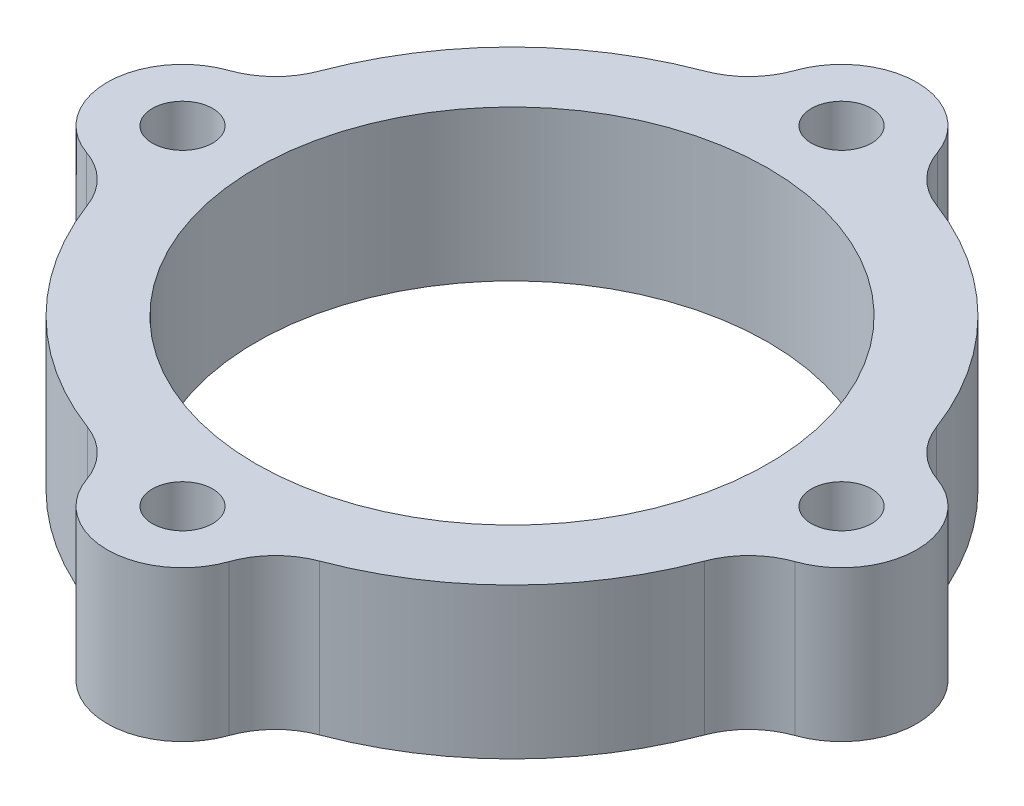
ISO-10303-21;
HEADER;
FILE_DESCRIPTION(('STEP AP214'),'2;1');
FILE_NAME('part.step','',(''),(''),'','','');
FILE_SCHEMA(('AUTOMOTIVE_DESIGN { 1 0 10303 214 1 1 1 1 }'));
ENDSEC;
DATA;
#1=APPLICATION_CONTEXT('core data for automotive mechanical design processes');
#2=APPLICATION_PROTOCOL_DEFINITION('international standard','automotive_design',2000,#1);
#3=PRODUCT_CONTEXT('',#1,'mechanical');
#4=PRODUCT('Part','Part','',(#3));
#5=PRODUCT_RELATED_PRODUCT_CATEGORY('part','',(#4));
#6=PRODUCT_DEFINITION_FORMATION('','',#4);
#7=PRODUCT_DEFINITION_CONTEXT('part definition',#1,'design');
#8=PRODUCT_DEFINITION('design','',#6,#7);
#9=PRODUCT_DEFINITION_SHAPE('','',#8);
#10=(LENGTH_UNIT() NAMED_UNIT(*) SI_UNIT(.MILLI.,.METRE.));
#11=(NAMED_UNIT(*) PLANE_ANGLE_UNIT() SI_UNIT($,.RADIAN.));
#12=(NAMED_UNIT(*) SI_UNIT($,.STERADIAN.) SOLID_ANGLE_UNIT());
#13=UNCERTAINTY_MEASURE_WITH_UNIT(LENGTH_MEASURE(1.E-05),#10,'distance_accuracy_value','');
#14=(GEOMETRIC_REPRESENTATION_CONTEXT(3) GLOBAL_UNCERTAINTY_ASSIGNED_CONTEXT((#13)) GLOBAL_UNIT_ASSIGNED_CONTEXT((#10,
#11,#12)) REPRESENTATION_CONTEXT('',''));
#15=CARTESIAN_POINT('',(0.,0.,0.));
#16=DIRECTION('',(0.,0.,1.));
#17=DIRECTION('',(1.,0.,0.));
#18=AXIS2_PLACEMENT_3D('',#15,#16,#17);
#19=CARTESIAN_POINT('',(17.5,8.,0.));
#20=DIRECTION('',(0.,-1.,0.));
#21=DIRECTION('',(0.,0.,-1.));
#22=AXIS2_PLACEMENT_3D('',#19,#20,#21);
#23=CYLINDRICAL_SURFACE('',#22,4.);
#24=CARTESIAN_POINT('',(17.5,8.,0.));
#25=DIRECTION('',(0.,1.,0.));
#26=DIRECTION('',(0.,0.,1.));
#27=AXIS2_PLACEMENT_3D('',#24,#25,#26);
#28=CIRCLE('',#27,4.);
#29=CARTESIAN_POINT('',(18.8142857142857,8.,3.77791649738642));
#30=VERTEX_POINT('',#29);
#31=CARTESIAN_POINT('',(18.8142857142857,8.,-3.77791649738642));
#32=VERTEX_POINT('',#31);
#33=EDGE_CURVE('E207',#30,#32,#28,.T.);
#34=ORIENTED_EDGE('',*,*,#33,.F.);
#35=DIRECTION('',(0.,-1.,0.));
#36=VECTOR('',#35,1.);
#37=CARTESIAN_POINT('',(18.8142857142857,8.,3.77791649738642));
#38=LINE('',#37,#36);
#39=CARTESIAN_POINT('',(18.8142857142857,0.,3.77791649738642));
#40=VERTEX_POINT('',#39);
#41=EDGE_CURVE('E225',#30,#40,#38,.T.);
#42=ORIENTED_EDGE('',*,*,#41,.T.);
#43=CARTESIAN_POINT('',(17.5,0.,0.));
#44=DIRECTION('',(0.,1.,0.));
#45=DIRECTION('',(0.,0.,1.));
#46=AXIS2_PLACEMENT_3D('',#43,#44,#45);
#47=CIRCLE('',#46,4.);
#48=CARTESIAN_POINT('',(18.8142857142857,0.,-3.77791649738642));
#49=VERTEX_POINT('',#48);
#50=EDGE_CURVE('E311',#40,#49,#47,.T.);
#51=ORIENTED_EDGE('',*,*,#50,.T.);
#52=DIRECTION('',(0.,-1.,0.));
#53=VECTOR('',#52,1.);
#54=CARTESIAN_POINT('',(18.8142857142857,8.,-3.77791649738642));
#55=LINE('',#54,#53);
#56=EDGE_CURVE('E223',#49,#32,#55,.F.);
#57=ORIENTED_EDGE('',*,*,#56,.T.);
#58=EDGE_LOOP('',(#34,#42,#51,#57));
#59=FACE_BOUND('',#58,.T.);
#60=ADVANCED_FACE('F39',(#59),#23,.T.);
#61=CARTESIAN_POINT('',(0.,8.,0.));
#62=DIRECTION('',(0.,-1.,0.));
#63=DIRECTION('',(0.,0.,-1.));
#64=AXIS2_PLACEMENT_3D('',#61,#62,#63);
#65=CYLINDRICAL_SURFACE('',#64,17.5);
#66=CARTESIAN_POINT('',(0.,8.,0.));
#67=DIRECTION('',(0.,1.,0.));
#68=DIRECTION('',(0.,0.,1.));
#69=AXIS2_PLACEMENT_3D('',#66,#67,#68);
#70=CIRCLE('',#69,17.5);
#71=CARTESIAN_POINT('',(16.3837209302326,8.,-6.15009662365232));
#72=VERTEX_POINT('',#71);
#73=CARTESIAN_POINT('',(6.15009662365231,8.,-16.3837209302326));
#74=VERTEX_POINT('',#73);
#75=EDGE_CURVE('E286',#72,#74,#70,.T.);
#76=ORIENTED_EDGE('',*,*,#75,.F.);
#77=DIRECTION('',(0.,-1.,0.));
#78=VECTOR('',#77,1.);
#79=CARTESIAN_POINT('',(16.3837209302326,8.,-6.15009662365232));
#80=LINE('',#79,#78);
#81=CARTESIAN_POINT('',(16.3837209302326,0.,-6.15009662365232));
#82=VERTEX_POINT('',#81);
#83=EDGE_CURVE('E230',#72,#82,#80,.T.);
#84=ORIENTED_EDGE('',*,*,#83,.T.);
#85=CARTESIAN_POINT('',(0.,0.,0.));
#86=DIRECTION('',(0.,1.,0.));
#87=DIRECTION('',(0.,0.,1.));
#88=AXIS2_PLACEMENT_3D('',#85,#86,#87);
#89=CIRCLE('',#88,17.5);
#90=CARTESIAN_POINT('',(6.15009662365231,0.,-16.3837209302326));
#91=VERTEX_POINT('',#90);
#92=EDGE_CURVE('E276',#82,#91,#89,.T.);
#93=ORIENTED_EDGE('',*,*,#92,.T.);
#94=DIRECTION('',(0.,-1.,0.));
#95=VECTOR('',#94,1.);
#96=CARTESIAN_POINT('',(6.15009662365231,8.,-16.3837209302326));
#97=LINE('',#96,#95);
#98=EDGE_CURVE('E228',#91,#74,#97,.F.);
#99=ORIENTED_EDGE('',*,*,#98,.T.);
#100=EDGE_LOOP('',(#76,#84,#93,#99));
#101=FACE_BOUND('',#100,.T.);
#102=ADVANCED_FACE('F319',(#101),#65,.T.);
#103=CARTESIAN_POINT('',(0.,8.,-17.5));
#104=DIRECTION('',(0.,-1.,0.));
#105=DIRECTION('',(0.,0.,-1.));
#106=AXIS2_PLACEMENT_3D('',#103,#104,#105);
#107=CYLINDRICAL_SURFACE('',#106,4.);
#108=CARTESIAN_POINT('',(0.,8.,-17.5));
#109=DIRECTION('',(0.,1.,0.));
#110=DIRECTION('',(0.,0.,1.));
#111=AXIS2_PLACEMENT_3D('',#108,#109,#110);
#112=CIRCLE('',#111,4.);
#113=CARTESIAN_POINT('',(3.77791649738642,8.,-18.8142857142857));
#114=VERTEX_POINT('',#113);
#115=CARTESIAN_POINT('',(-3.77791649738642,8.,-18.8142857142857));
#116=VERTEX_POINT('',#115);
#117=EDGE_CURVE('E282',#114,#116,#112,.T.);
#118=ORIENTED_EDGE('',*,*,#117,.F.);
#119=DIRECTION('',(0.,-1.,0.));
#120=VECTOR('',#119,1.);
#121=CARTESIAN_POINT('',(3.77791649738642,8.,-18.8142857142857));
#122=LINE('',#121,#120);
#123=CARTESIAN_POINT('',(3.77791649738642,0.,-18.8142857142857));
#124=VERTEX_POINT('',#123);
#125=EDGE_CURVE('E235',#114,#124,#122,.T.);
#126=ORIENTED_EDGE('',*,*,#125,.T.);
#127=CARTESIAN_POINT('',(0.,0.,-17.5));
#128=DIRECTION('',(0.,1.,0.));
#129=DIRECTION('',(0.,0.,1.));
#130=AXIS2_PLACEMENT_3D('',#127,#128,#129);
#131=CIRCLE('',#130,4.);
#132=CARTESIAN_POINT('',(-3.77791649738642,0.,-18.8142857142857));
#133=VERTEX_POINT('',#132);
#134=EDGE_CURVE('E268',#124,#133,#131,.T.);
#135=ORIENTED_EDGE('',*,*,#134,.T.);
#136=DIRECTION('',(0.,-1.,0.));
#137=VECTOR('',#136,1.);
#138=CARTESIAN_POINT('',(-3.77791649738642,8.,-18.8142857142857));
#139=LINE('',#138,#137);
#140=EDGE_CURVE('E233',#133,#116,#139,.F.);
#141=ORIENTED_EDGE('',*,*,#140,.T.);
#142=EDGE_LOOP('',(#118,#126,#135,#141));
#143=FACE_BOUND('',#142,.T.);
#144=ADVANCED_FACE('F274',(#143),#107,.T.);
#145=CARTESIAN_POINT('',(0.,8.,0.));
#146=DIRECTION('',(0.,-1.,0.));
#147=DIRECTION('',(0.,0.,-1.));
#148=AXIS2_PLACEMENT_3D('',#145,#146,#147);
#149=CYLINDRICAL_SURFACE('',#148,17.5);
#150=CARTESIAN_POINT('',(0.,0.,0.));
#151=DIRECTION('',(0.,1.,0.));
#152=DIRECTION('',(0.,0.,1.));
#153=AXIS2_PLACEMENT_3D('',#150,#151,#152);
#154=CIRCLE('',#153,17.5);
#155=CARTESIAN_POINT('',(-6.15009662365232,0.,-16.3837209302326));
#156=VERTEX_POINT('',#155);
#157=CARTESIAN_POINT('',(-16.3837209302326,0.,-6.15009662365232));
#158=VERTEX_POINT('',#157);
#159=EDGE_CURVE('E186',#156,#158,#154,.T.);
#160=ORIENTED_EDGE('',*,*,#159,.T.);
#161=DIRECTION('',(0.,-1.,0.));
#162=VECTOR('',#161,1.);
#163=CARTESIAN_POINT('',(-16.3837209302326,8.,-6.15009662365232));
#164=LINE('',#163,#162);
#165=CARTESIAN_POINT('',(-16.3837209302326,8.,-6.15009662365232));
#166=VERTEX_POINT('',#165);
#167=EDGE_CURVE('E54',#158,#166,#164,.F.);
#168=ORIENTED_EDGE('',*,*,#167,.T.);
#169=CARTESIAN_POINT('',(0.,8.,0.));
#170=DIRECTION('',(0.,1.,0.));
#171=DIRECTION('',(0.,0.,1.));
#172=AXIS2_PLACEMENT_3D('',#169,#170,#171);
#173=CIRCLE('',#172,17.5);
#174=CARTESIAN_POINT('',(-6.15009662365232,8.,-16.3837209302326));
#175=VERTEX_POINT('',#174);
#176=EDGE_CURVE('E279',#175,#166,#173,.T.);
#177=ORIENTED_EDGE('',*,*,#176,.F.);
#178=DIRECTION('',(0.,-1.,0.));
#179=VECTOR('',#178,1.);
#180=CARTESIAN_POINT('',(-6.15009662365232,8.,-16.3837209302326));
#181=LINE('',#180,#179);
#182=EDGE_CURVE('E238',#175,#156,#181,.T.);
#183=ORIENTED_EDGE('',*,*,#182,.T.);
#184=EDGE_LOOP('',(#160,#168,#177,#183));
#185=FACE_BOUND('',#184,.T.);
#186=ADVANCED_FACE('F278',(#185),#149,.T.);
#187=CARTESIAN_POINT('',(-17.5,8.,0.));
#188=DIRECTION('',(0.,-1.,0.));
#189=DIRECTION('',(0.,0.,-1.));
#190=AXIS2_PLACEMENT_3D('',#187,#188,#189);
#191=CYLINDRICAL_SURFACE('',#190,4.00000000000001);
#192=CARTESIAN_POINT('',(-17.5,0.,0.));
#193=DIRECTION('',(0.,1.,0.));
#194=DIRECTION('',(0.,0.,1.));
#195=AXIS2_PLACEMENT_3D('',#192,#193,#194);
#196=CIRCLE('',#195,4.00000000000001);
#197=CARTESIAN_POINT('',(-18.8142857142857,0.,-3.77791649738642));
#198=VERTEX_POINT('',#197);
#199=CARTESIAN_POINT('',(-18.8142857142857,0.,3.77791649738643));
#200=VERTEX_POINT('',#199);
#201=EDGE_CURVE('E181',#198,#200,#196,.T.);
#202=ORIENTED_EDGE('',*,*,#201,.T.);
#203=DIRECTION('',(0.,-1.,0.));
#204=VECTOR('',#203,1.);
#205=CARTESIAN_POINT('',(-18.8142857142857,8.,3.77791649738643));
#206=LINE('',#205,#204);
#207=CARTESIAN_POINT('',(-18.8142857142857,8.,3.77791649738643));
#208=VERTEX_POINT('',#207);
#209=EDGE_CURVE('E157',#200,#208,#206,.F.);
#210=ORIENTED_EDGE('',*,*,#209,.T.);
#211=CARTESIAN_POINT('',(-17.5,8.,0.));
#212=DIRECTION('',(0.,1.,0.));
#213=DIRECTION('',(0.,0.,1.));
#214=AXIS2_PLACEMENT_3D('',#211,#212,#213);
#215=CIRCLE('',#214,4.00000000000001);
#216=CARTESIAN_POINT('',(-18.8142857142857,8.,-3.77791649738642));
#217=VERTEX_POINT('',#216);
#218=EDGE_CURVE('E281',#217,#208,#215,.T.);
#219=ORIENTED_EDGE('',*,*,#218,.F.);
#220=DIRECTION('',(0.,-1.,0.));
#221=VECTOR('',#220,1.);
#222=CARTESIAN_POINT('',(-18.8142857142857,8.,-3.77791649738643));
#223=LINE('',#222,#221);
#224=EDGE_CURVE('E172',#217,#198,#223,.T.);
#225=ORIENTED_EDGE('',*,*,#224,.T.);
#226=EDGE_LOOP('',(#202,#210,#219,#225));
#227=FACE_BOUND('',#226,.T.);
#228=ADVANCED_FACE('F359',(#227),#191,.T.);
#229=CARTESIAN_POINT('',(0.,8.,0.));
#230=DIRECTION('',(0.,-1.,0.));
#231=DIRECTION('',(0.,0.,-1.));
#232=AXIS2_PLACEMENT_3D('',#229,#230,#231);
#233=CYLINDRICAL_SURFACE('',#232,17.5);
#234=CARTESIAN_POINT('',(0.,8.,0.));
#235=DIRECTION('',(0.,1.,0.));
#236=DIRECTION('',(0.,0.,1.));
#237=AXIS2_PLACEMENT_3D('',#234,#235,#236);
#238=CIRCLE('',#237,17.5);
#239=CARTESIAN_POINT('',(-16.3837209302326,8.,6.15009662365232));
#240=VERTEX_POINT('',#239);
#241=CARTESIAN_POINT('',(-6.15009662365231,8.,16.3837209302326));
#242=VERTEX_POINT('',#241);
#243=EDGE_CURVE('E171',#240,#242,#238,.T.);
#244=ORIENTED_EDGE('',*,*,#243,.F.);
#245=DIRECTION('',(0.,-1.,0.));
#246=VECTOR('',#245,1.);
#247=CARTESIAN_POINT('',(-16.3837209302326,8.,6.15009662365232));
#248=LINE('',#247,#246);
#249=CARTESIAN_POINT('',(-16.3837209302326,0.,6.15009662365232));
#250=VERTEX_POINT('',#249);
#251=EDGE_CURVE('E156',#240,#250,#248,.T.);
#252=ORIENTED_EDGE('',*,*,#251,.T.);
#253=CARTESIAN_POINT('',(0.,0.,0.));
#254=DIRECTION('',(0.,1.,0.));
#255=DIRECTION('',(0.,0.,1.));
#256=AXIS2_PLACEMENT_3D('',#253,#254,#255);
#257=CIRCLE('',#256,17.5);
#258=CARTESIAN_POINT('',(-6.15009662365231,0.,16.3837209302326));
#259=VERTEX_POINT('',#258);
#260=EDGE_CURVE('E168',#250,#259,#257,.T.);
#261=ORIENTED_EDGE('',*,*,#260,.T.);
#262=DIRECTION('',(0.,-1.,0.));
#263=VECTOR('',#262,1.);
#264=CARTESIAN_POINT('',(-6.15009662365231,8.,16.3837209302326));
#265=LINE('',#264,#263);
#266=EDGE_CURVE('E173',#259,#242,#265,.F.);
#267=ORIENTED_EDGE('',*,*,#266,.T.);
#268=EDGE_LOOP('',(#244,#252,#261,#267));
#269=FACE_BOUND('',#268,.T.);
#270=ADVANCED_FACE('F167',(#269),#233,.T.);
#271=CARTESIAN_POINT('',(0.,8.,17.5));
#272=DIRECTION('',(0.,-1.,0.));
#273=DIRECTION('',(0.,0.,-1.));
#274=AXIS2_PLACEMENT_3D('',#271,#272,#273);
#275=CYLINDRICAL_SURFACE('',#274,4.);
#276=CARTESIAN_POINT('',(0.,8.,17.5));
#277=DIRECTION('',(0.,1.,0.));
#278=DIRECTION('',(0.,0.,1.));
#279=AXIS2_PLACEMENT_3D('',#276,#277,#278);
#280=CIRCLE('',#279,4.);
#281=CARTESIAN_POINT('',(-3.77791649738642,8.,18.8142857142857));
#282=VERTEX_POINT('',#281);
#283=CARTESIAN_POINT('',(3.77791649738642,8.,18.8142857142857));
#284=VERTEX_POINT('',#283);
#285=EDGE_CURVE('E291',#282,#284,#280,.T.);
#286=ORIENTED_EDGE('',*,*,#285,.F.);
#287=DIRECTION('',(0.,-1.,0.));
#288=VECTOR('',#287,1.);
#289=CARTESIAN_POINT('',(-3.77791649738642,8.,18.8142857142857));
#290=LINE('',#289,#288);
#291=CARTESIAN_POINT('',(-3.77791649738642,0.,18.8142857142857));
#292=VERTEX_POINT('',#291);
#293=EDGE_CURVE('E215',#282,#292,#290,.T.);
#294=ORIENTED_EDGE('',*,*,#293,.T.);
#295=CARTESIAN_POINT('',(0.,0.,17.5));
#296=DIRECTION('',(0.,1.,0.));
#297=DIRECTION('',(0.,0.,1.));
#298=AXIS2_PLACEMENT_3D('',#295,#296,#297);
#299=CIRCLE('',#298,4.);
#300=CARTESIAN_POINT('',(3.77791649738642,0.,18.8142857142857));
#301=VERTEX_POINT('',#300);
#302=EDGE_CURVE('E180',#292,#301,#299,.T.);
#303=ORIENTED_EDGE('',*,*,#302,.T.);
#304=DIRECTION('',(0.,-1.,0.));
#305=VECTOR('',#304,1.);
#306=CARTESIAN_POINT('',(3.77791649738643,8.,18.8142857142857));
#307=LINE('',#306,#305);
#308=EDGE_CURVE('E213',#301,#284,#307,.F.);
#309=ORIENTED_EDGE('',*,*,#308,.T.);
#310=EDGE_LOOP('',(#286,#294,#303,#309));
#311=FACE_BOUND('',#310,.T.);
#312=ADVANCED_FACE('F351',(#311),#275,.T.);
#313=CARTESIAN_POINT('',(0.,8.,-17.5));
#314=DIRECTION('',(0.,-1.,0.));
#315=DIRECTION('',(0.,0.,-1.));
#316=AXIS2_PLACEMENT_3D('',#313,#314,#315);
#317=CYLINDRICAL_SURFACE('',#316,1.6);
#318=CARTESIAN_POINT('',(0.,8.,-17.5));
#319=DIRECTION('',(0.,1.,0.));
#320=DIRECTION('',(0.,0.,1.));
#321=AXIS2_PLACEMENT_3D('',#318,#319,#320);
#322=CIRCLE('',#321,1.6);
#323=CARTESIAN_POINT('',(0.,8.,-15.9));
#324=VERTEX_POINT('',#323);
#325=EDGE_CURVE('E306',#324,#324,#322,.T.);
#326=ORIENTED_EDGE('',*,*,#325,.T.);
#327=EDGE_LOOP('',(#326));
#328=FACE_BOUND('',#327,.T.);
#329=CARTESIAN_POINT('',(0.,0.,-17.5));
#330=DIRECTION('',(0.,1.,0.));
#331=DIRECTION('',(0.,0.,1.));
#332=AXIS2_PLACEMENT_3D('',#329,#330,#331);
#333=CIRCLE('',#332,1.6);
#334=CARTESIAN_POINT('',(0.,0.,-15.9));
#335=VERTEX_POINT('',#334);
#336=EDGE_CURVE('E201',#335,#335,#333,.T.);
#337=ORIENTED_EDGE('',*,*,#336,.F.);
#338=EDGE_LOOP('',(#337));
#339=FACE_BOUND('',#338,.T.);
#340=ADVANCED_FACE('F469',(#328,#339),#317,.F.);
#341=CARTESIAN_POINT('',(0.,8.,17.5));
#342=DIRECTION('',(0.,-1.,0.));
#343=DIRECTION('',(0.,0.,-1.));
#344=AXIS2_PLACEMENT_3D('',#341,#342,#343);
#345=CYLINDRICAL_SURFACE('',#344,1.6);
#346=CARTESIAN_POINT('',(0.,8.,17.5));
#347=DIRECTION('',(0.,1.,0.));
#348=DIRECTION('',(0.,0.,1.));
#349=AXIS2_PLACEMENT_3D('',#346,#347,#348);
#350=CIRCLE('',#349,1.6);
#351=CARTESIAN_POINT('',(0.,8.,19.1));
#352=VERTEX_POINT('',#351);
#353=EDGE_CURVE('E303',#352,#352,#350,.T.);
#354=ORIENTED_EDGE('',*,*,#353,.T.);
#355=EDGE_LOOP('',(#354));
#356=FACE_BOUND('',#355,.T.);
#357=CARTESIAN_POINT('',(0.,0.,17.5));
#358=DIRECTION('',(0.,1.,0.));
#359=DIRECTION('',(0.,0.,1.));
#360=AXIS2_PLACEMENT_3D('',#357,#358,#359);
#361=CIRCLE('',#360,1.6);
#362=CARTESIAN_POINT('',(0.,0.,19.1));
#363=VERTEX_POINT('',#362);
#364=EDGE_CURVE('E198',#363,#363,#361,.T.);
#365=ORIENTED_EDGE('',*,*,#364,.F.);
#366=EDGE_LOOP('',(#365));
#367=FACE_BOUND('',#366,.T.);
#368=ADVANCED_FACE('F537',(#356,#367),#345,.F.);
#369=CARTESIAN_POINT('',(0.,8.,0.));
#370=DIRECTION('',(0.,-1.,0.));
#371=DIRECTION('',(0.,0.,-1.));
#372=AXIS2_PLACEMENT_3D('',#369,#370,#371);
#373=CYLINDRICAL_SURFACE('',#372,13.6);
#374=CARTESIAN_POINT('',(0.,8.,0.));
#375=DIRECTION('',(0.,1.,0.));
#376=DIRECTION('',(0.,0.,1.));
#377=AXIS2_PLACEMENT_3D('',#374,#375,#376);
#378=CIRCLE('',#377,13.6);
#379=CARTESIAN_POINT('',(0.,8.,13.6));
#380=VERTEX_POINT('',#379);
#381=EDGE_CURVE('E300',#380,#380,#378,.T.);
#382=ORIENTED_EDGE('',*,*,#381,.T.);
#383=EDGE_LOOP('',(#382));
#384=FACE_BOUND('',#383,.T.);
#385=CARTESIAN_POINT('',(0.,0.,0.));
#386=DIRECTION('',(0.,1.,0.));
#387=DIRECTION('',(0.,0.,1.));
#388=AXIS2_PLACEMENT_3D('',#385,#386,#387);
#389=CIRCLE('',#388,13.6);
#390=CARTESIAN_POINT('',(0.,0.,13.6));
#391=VERTEX_POINT('',#390);
#392=EDGE_CURVE('E195',#391,#391,#389,.T.);
#393=ORIENTED_EDGE('',*,*,#392,.F.);
#394=EDGE_LOOP('',(#393));
#395=FACE_BOUND('',#394,.T.);
#396=ADVANCED_FACE('F527',(#384,#395),#373,.F.);
#397=CARTESIAN_POINT('',(17.5,8.,0.));
#398=DIRECTION('',(0.,-1.,0.));
#399=DIRECTION('',(0.,0.,-1.));
#400=AXIS2_PLACEMENT_3D('',#397,#398,#399);
#401=CYLINDRICAL_SURFACE('',#400,1.6);
#402=CARTESIAN_POINT('',(17.5,8.,0.));
#403=DIRECTION('',(0.,1.,0.));
#404=DIRECTION('',(0.,0.,1.));
#405=AXIS2_PLACEMENT_3D('',#402,#403,#404);
#406=CIRCLE('',#405,1.6);
#407=CARTESIAN_POINT('',(17.5,8.,1.6));
#408=VERTEX_POINT('',#407);
#409=EDGE_CURVE('E297',#408,#408,#406,.T.);
#410=ORIENTED_EDGE('',*,*,#409,.T.);
#411=EDGE_LOOP('',(#410));
#412=FACE_BOUND('',#411,.T.);
#413=CARTESIAN_POINT('',(17.5,0.,0.));
#414=DIRECTION('',(0.,1.,0.));
#415=DIRECTION('',(0.,0.,1.));
#416=AXIS2_PLACEMENT_3D('',#413,#414,#415);
#417=CIRCLE('',#416,1.6);
#418=CARTESIAN_POINT('',(17.5,0.,1.6));
#419=VERTEX_POINT('',#418);
#420=EDGE_CURVE('E192',#419,#419,#417,.T.);
#421=ORIENTED_EDGE('',*,*,#420,.F.);
#422=EDGE_LOOP('',(#421));
#423=FACE_BOUND('',#422,.T.);
#424=ADVANCED_FACE('F457',(#412,#423),#401,.F.);
#425=CARTESIAN_POINT('',(0.,8.,0.));
#426=DIRECTION('',(0.,-1.,0.));
#427=DIRECTION('',(0.,0.,-1.));
#428=AXIS2_PLACEMENT_3D('',#425,#426,#427);
#429=CYLINDRICAL_SURFACE('',#428,17.5);
#430=CARTESIAN_POINT('',(0.,8.,0.));
#431=DIRECTION('',(0.,1.,0.));
#432=DIRECTION('',(0.,0.,1.));
#433=AXIS2_PLACEMENT_3D('',#430,#431,#432);
#434=CIRCLE('',#433,17.5);
#435=CARTESIAN_POINT('',(6.15009662365232,8.,16.3837209302326));
#436=VERTEX_POINT('',#435);
#437=CARTESIAN_POINT('',(16.3837209302326,8.,6.15009662365231));
#438=VERTEX_POINT('',#437);
#439=EDGE_CURVE('E294',#436,#438,#434,.T.);
#440=ORIENTED_EDGE('',*,*,#439,.F.);
#441=DIRECTION('',(0.,-1.,0.));
#442=VECTOR('',#441,1.);
#443=CARTESIAN_POINT('',(6.15009662365232,8.,16.3837209302326));
#444=LINE('',#443,#442);
#445=CARTESIAN_POINT('',(6.15009662365232,0.,16.3837209302326));
#446=VERTEX_POINT('',#445);
#447=EDGE_CURVE('E220',#436,#446,#444,.T.);
#448=ORIENTED_EDGE('',*,*,#447,.T.);
#449=CARTESIAN_POINT('',(0.,0.,0.));
#450=DIRECTION('',(0.,1.,0.));
#451=DIRECTION('',(0.,0.,1.));
#452=AXIS2_PLACEMENT_3D('',#449,#450,#451);
#453=CIRCLE('',#452,17.5);
#454=CARTESIAN_POINT('',(16.3837209302326,0.,6.15009662365231));
#455=VERTEX_POINT('',#454);
#456=EDGE_CURVE('E184',#446,#455,#453,.T.);
#457=ORIENTED_EDGE('',*,*,#456,.T.);
#458=DIRECTION('',(0.,-1.,0.));
#459=VECTOR('',#458,1.);
#460=CARTESIAN_POINT('',(16.3837209302326,8.,6.15009662365231));
#461=LINE('',#460,#459);
#462=EDGE_CURVE('E218',#455,#438,#461,.F.);
#463=ORIENTED_EDGE('',*,*,#462,.T.);
#464=EDGE_LOOP('',(#440,#448,#457,#463));
#465=FACE_BOUND('',#464,.T.);
#466=ADVANCED_FACE('F343',(#465),#429,.T.);
#467=CARTESIAN_POINT('',(-17.5,8.,0.));
#468=DIRECTION('',(0.,-1.,0.));
#469=DIRECTION('',(0.,0.,-1.));
#470=AXIS2_PLACEMENT_3D('',#467,#468,#469);
#471=CYLINDRICAL_SURFACE('',#470,1.60000000000001);
#472=CARTESIAN_POINT('',(-17.5,8.,0.));
#473=DIRECTION('',(0.,1.,0.));
#474=DIRECTION('',(0.,0.,1.));
#475=AXIS2_PLACEMENT_3D('',#472,#473,#474);
#476=CIRCLE('',#475,1.60000000000001);
#477=CARTESIAN_POINT('',(-17.5,8.,1.60000000000001));
#478=VERTEX_POINT('',#477);
#479=EDGE_CURVE('E208',#478,#478,#476,.T.);
#480=ORIENTED_EDGE('',*,*,#479,.T.);
#481=EDGE_LOOP('',(#480));
#482=FACE_BOUND('',#481,.T.);
#483=CARTESIAN_POINT('',(-17.5,0.,0.));
#484=DIRECTION('',(0.,1.,0.));
#485=DIRECTION('',(0.,0.,1.));
#486=AXIS2_PLACEMENT_3D('',#483,#484,#485);
#487=CIRCLE('',#486,1.60000000000001);
#488=CARTESIAN_POINT('',(-17.5,0.,1.60000000000001));
#489=VERTEX_POINT('',#488);
#490=EDGE_CURVE('E204',#489,#489,#487,.T.);
#491=ORIENTED_EDGE('',*,*,#490,.F.);
#492=EDGE_LOOP('',(#491));
#493=FACE_BOUND('',#492,.T.);
#494=ADVANCED_FACE('F445',(#482,#493),#471,.F.);
#495=CARTESIAN_POINT('',(0.,8.,0.));
#496=DIRECTION('',(0.,1.,0.));
#497=DIRECTION('',(0.,0.,1.));
#498=AXIS2_PLACEMENT_3D('',#495,#496,#497);
#499=PLANE('',#498);
#500=ORIENTED_EDGE('',*,*,#439,.T.);
#501=CARTESIAN_POINT('',(20.1285714285714,8.,7.55583299477284));
#502=DIRECTION('',(0.,1.,0.));
#503=DIRECTION('',(0.,0.,1.));
#504=AXIS2_PLACEMENT_3D('',#501,#502,#503);
#505=CIRCLE('',#504,4.);
#506=EDGE_CURVE('E252',#438,#30,#505,.F.);
#507=ORIENTED_EDGE('',*,*,#506,.T.);
#508=ORIENTED_EDGE('',*,*,#33,.T.);
#509=CARTESIAN_POINT('',(20.1285714285714,8.,-7.55583299477285));
#510=DIRECTION('',(0.,1.,0.));
#511=DIRECTION('',(0.,0.,1.));
#512=AXIS2_PLACEMENT_3D('',#509,#510,#511);
#513=CIRCLE('',#512,4.);
#514=EDGE_CURVE('E256',#32,#72,#513,.F.);
#515=ORIENTED_EDGE('',*,*,#514,.T.);
#516=ORIENTED_EDGE('',*,*,#75,.T.);
#517=CARTESIAN_POINT('',(7.55583299477284,8.,-20.1285714285714));
#518=DIRECTION('',(0.,1.,0.));
#519=DIRECTION('',(0.,0.,1.));
#520=AXIS2_PLACEMENT_3D('',#517,#518,#519);
#521=CIRCLE('',#520,4.);
#522=EDGE_CURVE('E260',#74,#114,#521,.F.);
#523=ORIENTED_EDGE('',*,*,#522,.T.);
#524=ORIENTED_EDGE('',*,*,#117,.T.);
#525=CARTESIAN_POINT('',(-7.55583299477285,8.,-20.1285714285714));
#526=DIRECTION('',(0.,1.,0.));
#527=DIRECTION('',(0.,0.,1.));
#528=AXIS2_PLACEMENT_3D('',#525,#526,#527);
#529=CIRCLE('',#528,4.);
#530=EDGE_CURVE('E11',#116,#175,#529,.F.);
#531=ORIENTED_EDGE('',*,*,#530,.T.);
#532=ORIENTED_EDGE('',*,*,#176,.T.);
#533=CARTESIAN_POINT('',(-20.1285714285714,8.,-7.55583299477285));
#534=DIRECTION('',(0.,1.,0.));
#535=DIRECTION('',(0.,0.,1.));
#536=AXIS2_PLACEMENT_3D('',#533,#534,#535);
#537=CIRCLE('',#536,4.);
#538=EDGE_CURVE('E264',#166,#217,#537,.F.);
#539=ORIENTED_EDGE('',*,*,#538,.T.);
#540=ORIENTED_EDGE('',*,*,#218,.T.);
#541=CARTESIAN_POINT('',(-20.1285714285714,8.,7.55583299477285));
#542=DIRECTION('',(0.,1.,0.));
#543=DIRECTION('',(0.,0.,1.));
#544=AXIS2_PLACEMENT_3D('',#541,#542,#543);
#545=CIRCLE('',#544,4.);
#546=EDGE_CURVE('E162',#208,#240,#545,.F.);
#547=ORIENTED_EDGE('',*,*,#546,.T.);
#548=ORIENTED_EDGE('',*,*,#243,.T.);
#549=CARTESIAN_POINT('',(-7.55583299477284,8.,20.1285714285714));
#550=DIRECTION('',(0.,1.,0.));
#551=DIRECTION('',(0.,0.,1.));
#552=AXIS2_PLACEMENT_3D('',#549,#550,#551);
#553=CIRCLE('',#552,4.);
#554=EDGE_CURVE('E244',#242,#282,#553,.F.);
#555=ORIENTED_EDGE('',*,*,#554,.T.);
#556=ORIENTED_EDGE('',*,*,#285,.T.);
#557=CARTESIAN_POINT('',(7.55583299477285,8.,20.1285714285714));
#558=DIRECTION('',(0.,1.,0.));
#559=DIRECTION('',(0.,0.,1.));
#560=AXIS2_PLACEMENT_3D('',#557,#558,#559);
#561=CIRCLE('',#560,4.);
#562=EDGE_CURVE('E248',#284,#436,#561,.F.);
#563=ORIENTED_EDGE('',*,*,#562,.T.);
#564=EDGE_LOOP('',(#500,#507,#508,#515,#516,#523,#524,#531,#532,#539,#540,#547,#548,#555,#556,#563));
#565=FACE_BOUND('',#564,.T.);
#566=ORIENTED_EDGE('',*,*,#409,.F.);
#567=EDGE_LOOP('',(#566));
#568=FACE_BOUND('',#567,.T.);
#569=ORIENTED_EDGE('',*,*,#381,.F.);
#570=EDGE_LOOP('',(#569));
#571=FACE_BOUND('',#570,.T.);
#572=ORIENTED_EDGE('',*,*,#353,.F.);
#573=EDGE_LOOP('',(#572));
#574=FACE_BOUND('',#573,.T.);
#575=ORIENTED_EDGE('',*,*,#325,.F.);
#576=EDGE_LOOP('',(#575));
#577=FACE_BOUND('',#576,.T.);
#578=ORIENTED_EDGE('',*,*,#479,.F.);
#579=EDGE_LOOP('',(#578));
#580=FACE_BOUND('',#579,.T.);
#581=ADVANCED_FACE('F325',(#565,#568,#571,#574,#577,#580),#499,.T.);
#582=CARTESIAN_POINT('',(0.,0.,0.));
#583=DIRECTION('',(0.,1.,0.));
#584=DIRECTION('',(0.,0.,1.));
#585=AXIS2_PLACEMENT_3D('',#582,#583,#584);
#586=PLANE('',#585);
#587=ORIENTED_EDGE('',*,*,#50,.F.);
#588=CARTESIAN_POINT('',(20.1285714285714,0.,7.55583299477284));
#589=DIRECTION('',(0.,1.,0.));
#590=DIRECTION('',(0.,0.,1.));
#591=AXIS2_PLACEMENT_3D('',#588,#589,#590);
#592=CIRCLE('',#591,4.);
#593=EDGE_CURVE('E250',#40,#455,#592,.T.);
#594=ORIENTED_EDGE('',*,*,#593,.T.);
#595=ORIENTED_EDGE('',*,*,#456,.F.);
#596=CARTESIAN_POINT('',(7.55583299477285,0.,20.1285714285714));
#597=DIRECTION('',(0.,1.,0.));
#598=DIRECTION('',(0.,0.,1.));
#599=AXIS2_PLACEMENT_3D('',#596,#597,#598);
#600=CIRCLE('',#599,4.);
#601=EDGE_CURVE('E246',#446,#301,#600,.T.);
#602=ORIENTED_EDGE('',*,*,#601,.T.);
#603=ORIENTED_EDGE('',*,*,#302,.F.);
#604=CARTESIAN_POINT('',(-7.55583299477284,0.,20.1285714285714));
#605=DIRECTION('',(0.,1.,0.));
#606=DIRECTION('',(0.,0.,1.));
#607=AXIS2_PLACEMENT_3D('',#604,#605,#606);
#608=CIRCLE('',#607,4.);
#609=EDGE_CURVE('E179',#292,#259,#608,.T.);
#610=ORIENTED_EDGE('',*,*,#609,.T.);
#611=ORIENTED_EDGE('',*,*,#260,.F.);
#612=CARTESIAN_POINT('',(-20.1285714285714,0.,7.55583299477285));
#613=DIRECTION('',(0.,1.,0.));
#614=DIRECTION('',(0.,0.,1.));
#615=AXIS2_PLACEMENT_3D('',#612,#613,#614);
#616=CIRCLE('',#615,4.);
#617=EDGE_CURVE('E152',#250,#200,#616,.T.);
#618=ORIENTED_EDGE('',*,*,#617,.T.);
#619=ORIENTED_EDGE('',*,*,#201,.F.);
#620=CARTESIAN_POINT('',(-20.1285714285714,0.,-7.55583299477285));
#621=DIRECTION('',(0.,1.,0.));
#622=DIRECTION('',(0.,0.,1.));
#623=AXIS2_PLACEMENT_3D('',#620,#621,#622);
#624=CIRCLE('',#623,4.);
#625=EDGE_CURVE('E262',#198,#158,#624,.T.);
#626=ORIENTED_EDGE('',*,*,#625,.T.);
#627=ORIENTED_EDGE('',*,*,#159,.F.);
#628=CARTESIAN_POINT('',(-7.55583299477285,0.,-20.1285714285714));
#629=DIRECTION('',(0.,1.,0.));
#630=DIRECTION('',(0.,0.,1.));
#631=AXIS2_PLACEMENT_3D('',#628,#629,#630);
#632=CIRCLE('',#631,4.);
#633=EDGE_CURVE('E47',#156,#133,#632,.T.);
#634=ORIENTED_EDGE('',*,*,#633,.T.);
#635=ORIENTED_EDGE('',*,*,#134,.F.);
#636=CARTESIAN_POINT('',(7.55583299477284,0.,-20.1285714285714));
#637=DIRECTION('',(0.,1.,0.));
#638=DIRECTION('',(0.,0.,1.));
#639=AXIS2_PLACEMENT_3D('',#636,#637,#638);
#640=CIRCLE('',#639,4.);
#641=EDGE_CURVE('E258',#124,#91,#640,.T.);
#642=ORIENTED_EDGE('',*,*,#641,.T.);
#643=ORIENTED_EDGE('',*,*,#92,.F.);
#644=CARTESIAN_POINT('',(20.1285714285714,0.,-7.55583299477285));
#645=DIRECTION('',(0.,1.,0.));
#646=DIRECTION('',(0.,0.,1.));
#647=AXIS2_PLACEMENT_3D('',#644,#645,#646);
#648=CIRCLE('',#647,4.);
#649=EDGE_CURVE('E254',#82,#49,#648,.T.);
#650=ORIENTED_EDGE('',*,*,#649,.T.);
#651=EDGE_LOOP('',(#587,#594,#595,#602,#603,#610,#611,#618,#619,#626,#627,#634,#635,#642,#643,#650));
#652=FACE_BOUND('',#651,.T.);
#653=ORIENTED_EDGE('',*,*,#420,.T.);
#654=EDGE_LOOP('',(#653));
#655=FACE_BOUND('',#654,.T.);
#656=ORIENTED_EDGE('',*,*,#392,.T.);
#657=EDGE_LOOP('',(#656));
#658=FACE_BOUND('',#657,.T.);
#659=ORIENTED_EDGE('',*,*,#364,.T.);
#660=EDGE_LOOP('',(#659));
#661=FACE_BOUND('',#660,.T.);
#662=ORIENTED_EDGE('',*,*,#336,.T.);
#663=EDGE_LOOP('',(#662));
#664=FACE_BOUND('',#663,.T.);
#665=ORIENTED_EDGE('',*,*,#490,.T.);
#666=EDGE_LOOP('',(#665));
#667=FACE_BOUND('',#666,.T.);
#668=ADVANCED_FACE('F176',(#652,#655,#658,#661,#664,#667),#586,.F.);
#669=CARTESIAN_POINT('',(-20.1285714285714,8.,7.55583299477285));
#670=DIRECTION('',(0.,1.,0.));
#671=DIRECTION('',(0.,0.,1.));
#672=AXIS2_PLACEMENT_3D('',#669,#670,#671);
#673=CYLINDRICAL_SURFACE('',#672,4.);
#674=ORIENTED_EDGE('',*,*,#546,.F.);
#675=ORIENTED_EDGE('',*,*,#209,.F.);
#676=ORIENTED_EDGE('',*,*,#617,.F.);
#677=ORIENTED_EDGE('',*,*,#251,.F.);
#678=EDGE_LOOP('',(#674,#675,#676,#677));
#679=FACE_BOUND('',#678,.T.);
#680=ADVANCED_FACE('F155',(#679),#673,.F.);
#681=CARTESIAN_POINT('',(-7.55583299477284,8.,20.1285714285714));
#682=DIRECTION('',(0.,1.,0.));
#683=DIRECTION('',(0.,0.,1.));
#684=AXIS2_PLACEMENT_3D('',#681,#682,#683);
#685=CYLINDRICAL_SURFACE('',#684,4.);
#686=ORIENTED_EDGE('',*,*,#554,.F.);
#687=ORIENTED_EDGE('',*,*,#266,.F.);
#688=ORIENTED_EDGE('',*,*,#609,.F.);
#689=ORIENTED_EDGE('',*,*,#293,.F.);
#690=EDGE_LOOP('',(#686,#687,#688,#689));
#691=FACE_BOUND('',#690,.T.);
#692=ADVANCED_FACE('F355',(#691),#685,.F.);
#693=CARTESIAN_POINT('',(7.55583299477285,8.,20.1285714285714));
#694=DIRECTION('',(0.,1.,0.));
#695=DIRECTION('',(0.,0.,1.));
#696=AXIS2_PLACEMENT_3D('',#693,#694,#695);
#697=CYLINDRICAL_SURFACE('',#696,4.);
#698=ORIENTED_EDGE('',*,*,#562,.F.);
#699=ORIENTED_EDGE('',*,*,#308,.F.);
#700=ORIENTED_EDGE('',*,*,#601,.F.);
#701=ORIENTED_EDGE('',*,*,#447,.F.);
#702=EDGE_LOOP('',(#698,#699,#700,#701));
#703=FACE_BOUND('',#702,.T.);
#704=ADVANCED_FACE('F347',(#703),#697,.F.);
#705=CARTESIAN_POINT('',(20.1285714285714,8.,7.55583299477284));
#706=DIRECTION('',(0.,1.,0.));
#707=DIRECTION('',(0.,0.,1.));
#708=AXIS2_PLACEMENT_3D('',#705,#706,#707);
#709=CYLINDRICAL_SURFACE('',#708,4.);
#710=ORIENTED_EDGE('',*,*,#506,.F.);
#711=ORIENTED_EDGE('',*,*,#462,.F.);
#712=ORIENTED_EDGE('',*,*,#593,.F.);
#713=ORIENTED_EDGE('',*,*,#41,.F.);
#714=EDGE_LOOP('',(#710,#711,#712,#713));
#715=FACE_BOUND('',#714,.T.);
#716=ADVANCED_FACE('F338',(#715),#709,.F.);
#717=CARTESIAN_POINT('',(20.1285714285714,8.,-7.55583299477285));
#718=DIRECTION('',(0.,1.,0.));
#719=DIRECTION('',(0.,0.,1.));
#720=AXIS2_PLACEMENT_3D('',#717,#718,#719);
#721=CYLINDRICAL_SURFACE('',#720,4.);
#722=ORIENTED_EDGE('',*,*,#514,.F.);
#723=ORIENTED_EDGE('',*,*,#56,.F.);
#724=ORIENTED_EDGE('',*,*,#649,.F.);
#725=ORIENTED_EDGE('',*,*,#83,.F.);
#726=EDGE_LOOP('',(#722,#723,#724,#725));
#727=FACE_BOUND('',#726,.T.);
#728=ADVANCED_FACE('F336',(#727),#721,.F.);
#729=CARTESIAN_POINT('',(7.55583299477284,8.,-20.1285714285714));
#730=DIRECTION('',(0.,1.,0.));
#731=DIRECTION('',(0.,0.,1.));
#732=AXIS2_PLACEMENT_3D('',#729,#730,#731);
#733=CYLINDRICAL_SURFACE('',#732,4.);
#734=ORIENTED_EDGE('',*,*,#522,.F.);
#735=ORIENTED_EDGE('',*,*,#98,.F.);
#736=ORIENTED_EDGE('',*,*,#641,.F.);
#737=ORIENTED_EDGE('',*,*,#125,.F.);
#738=EDGE_LOOP('',(#734,#735,#736,#737));
#739=FACE_BOUND('',#738,.T.);
#740=ADVANCED_FACE('F324',(#739),#733,.F.);
#741=CARTESIAN_POINT('',(-20.1285714285714,8.,-7.55583299477285));
#742=DIRECTION('',(0.,1.,0.));
#743=DIRECTION('',(0.,0.,1.));
#744=AXIS2_PLACEMENT_3D('',#741,#742,#743);
#745=CYLINDRICAL_SURFACE('',#744,4.);
#746=ORIENTED_EDGE('',*,*,#538,.F.);
#747=ORIENTED_EDGE('',*,*,#167,.F.);
#748=ORIENTED_EDGE('',*,*,#625,.F.);
#749=ORIENTED_EDGE('',*,*,#224,.F.);
#750=EDGE_LOOP('',(#746,#747,#748,#749));
#751=FACE_BOUND('',#750,.T.);
#752=ADVANCED_FACE('F361',(#751),#745,.F.);
#753=CARTESIAN_POINT('',(-7.55583299477285,8.,-20.1285714285714));
#754=DIRECTION('',(0.,1.,0.));
#755=DIRECTION('',(0.,0.,1.));
#756=AXIS2_PLACEMENT_3D('',#753,#754,#755);
#757=CYLINDRICAL_SURFACE('',#756,4.);
#758=ORIENTED_EDGE('',*,*,#530,.F.);
#759=ORIENTED_EDGE('',*,*,#140,.F.);
#760=ORIENTED_EDGE('',*,*,#633,.F.);
#761=ORIENTED_EDGE('',*,*,#182,.F.);
#762=EDGE_LOOP('',(#758,#759,#760,#761));
#763=FACE_BOUND('',#762,.T.);
#764=ADVANCED_FACE('F41',(#763),#757,.F.);
#765=CLOSED_SHELL('',(#60,#102,#144,#186,#228,#270,#312,#340,#368,#396,#424,#466,#494,#581,#668,
#680,#692,#704,#716,#728,#740,#752,#764));
#766=MANIFOLD_SOLID_BREP('B2',#765);
#767=ADVANCED_BREP_SHAPE_REPRESENTATION('',(#18,#766),#14);
#768=SHAPE_DEFINITION_REPRESENTATION(#9,#767);
ENDSEC;
END-ISO-10303-21;
